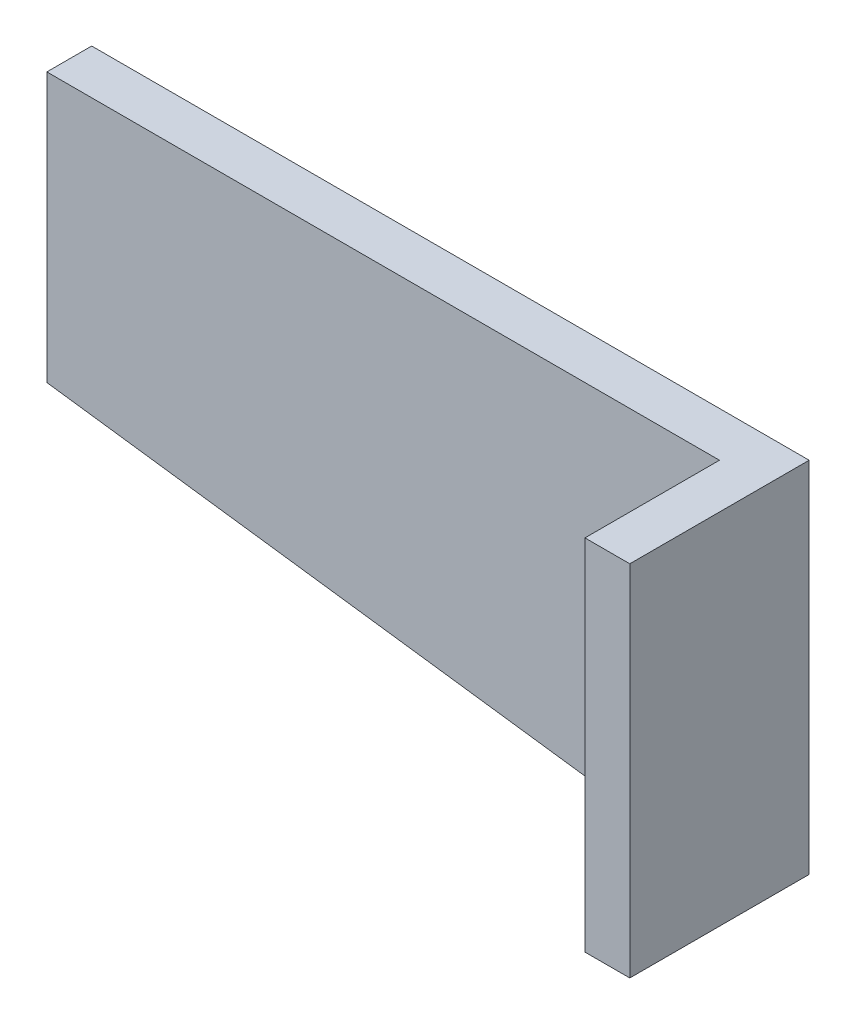
ISO-10303-21;
HEADER;
FILE_DESCRIPTION(('STEP AP214'),'2;1');
FILE_NAME('part.step','',(''),(''),'','','');
FILE_SCHEMA(('AUTOMOTIVE_DESIGN { 1 0 10303 214 1 1 1 1 }'));
ENDSEC;
DATA;
#1=APPLICATION_CONTEXT('core data for automotive mechanical design processes');
#2=APPLICATION_PROTOCOL_DEFINITION('international standard','automotive_design',2000,#1);
#3=PRODUCT_CONTEXT('',#1,'mechanical');
#4=PRODUCT('Part','Part','',(#3));
#5=PRODUCT_RELATED_PRODUCT_CATEGORY('part','',(#4));
#6=PRODUCT_DEFINITION_FORMATION('','',#4);
#7=PRODUCT_DEFINITION_CONTEXT('part definition',#1,'design');
#8=PRODUCT_DEFINITION('design','',#6,#7);
#9=PRODUCT_DEFINITION_SHAPE('','',#8);
#10=(LENGTH_UNIT() NAMED_UNIT(*) SI_UNIT(.MILLI.,.METRE.));
#11=(NAMED_UNIT(*) PLANE_ANGLE_UNIT() SI_UNIT($,.RADIAN.));
#12=(NAMED_UNIT(*) SI_UNIT($,.STERADIAN.) SOLID_ANGLE_UNIT());
#13=UNCERTAINTY_MEASURE_WITH_UNIT(LENGTH_MEASURE(1.E-05),#10,'distance_accuracy_value','');
#14=(GEOMETRIC_REPRESENTATION_CONTEXT(3) GLOBAL_UNCERTAINTY_ASSIGNED_CONTEXT((#13)) GLOBAL_UNIT_ASSIGNED_CONTEXT((#10,
#11,#12)) REPRESENTATION_CONTEXT('',''));
#15=CARTESIAN_POINT('',(0.,0.,0.));
#16=DIRECTION('',(0.,0.,1.));
#17=DIRECTION('',(1.,0.,0.));
#18=AXIS2_PLACEMENT_3D('',#15,#16,#17);
#19=CARTESIAN_POINT('',(-2.49563318777292,-18.7172489082969,3.175));
#20=DIRECTION('',(-0.132163720091018,-0.991227900682635,0.));
#21=DIRECTION('',(0.991227900682635,-0.132163720091018,0.));
#22=AXIS2_PLACEMENT_3D('',#19,#20,#21);
#23=PLANE('',#22);
#24=DIRECTION('',(-0.991227900682635,0.132163720091018,0.));
#25=VECTOR('',#24,1.);
#26=CARTESIAN_POINT('',(-2.49563318777292,-18.7172489082969,0.));
#27=LINE('',#26,#25);
#28=CARTESIAN_POINT('',(47.625,-25.4,0.));
#29=VERTEX_POINT('',#28);
#30=CARTESIAN_POINT('',(0.,-19.05,0.));
#31=VERTEX_POINT('',#30);
#32=EDGE_CURVE('E74',#29,#31,#27,.T.);
#33=ORIENTED_EDGE('',*,*,#32,.F.);
#34=DIRECTION('',(0.,0.,-1.));
#35=VECTOR('',#34,1.);
#36=CARTESIAN_POINT('',(47.625,-25.4,3.175));
#37=LINE('',#36,#35);
#38=CARTESIAN_POINT('',(47.625,-25.4,3.175));
#39=VERTEX_POINT('',#38);
#40=EDGE_CURVE('E11',#39,#29,#37,.T.);
#41=ORIENTED_EDGE('',*,*,#40,.F.);
#42=DIRECTION('',(-0.991227900682635,0.132163720091018,0.));
#43=VECTOR('',#42,1.);
#44=CARTESIAN_POINT('',(-2.49563318777292,-18.7172489082969,3.175));
#45=LINE('',#44,#43);
#46=CARTESIAN_POINT('',(0.,-19.05,3.175));
#47=VERTEX_POINT('',#46);
#48=EDGE_CURVE('E77',#39,#47,#45,.T.);
#49=ORIENTED_EDGE('',*,*,#48,.T.);
#50=DIRECTION('',(0.,0.,-1.));
#51=VECTOR('',#50,1.);
#52=CARTESIAN_POINT('',(0.,-19.05,3.175));
#53=LINE('',#52,#51);
#54=EDGE_CURVE('E52',#47,#31,#53,.T.);
#55=ORIENTED_EDGE('',*,*,#54,.T.);
#56=EDGE_LOOP('',(#33,#41,#49,#55));
#57=FACE_BOUND('',#56,.T.);
#58=ADVANCED_FACE('F36',(#57),#23,.T.);
#59=CARTESIAN_POINT('',(0.,-25.4,3.175));
#60=DIRECTION('',(0.,-1.,0.));
#61=DIRECTION('',(0.,0.,-1.));
#62=AXIS2_PLACEMENT_3D('',#59,#60,#61);
#63=PLANE('',#62);
#64=DIRECTION('',(-1.,0.,0.));
#65=VECTOR('',#64,1.);
#66=CARTESIAN_POINT('',(0.,-25.4,0.));
#67=LINE('',#66,#65);
#68=CARTESIAN_POINT('',(50.8,-25.4,0.));
#69=VERTEX_POINT('',#68);
#70=EDGE_CURVE('E87',#69,#29,#67,.T.);
#71=ORIENTED_EDGE('',*,*,#70,.F.);
#72=DIRECTION('',(0.,0.,-1.));
#73=VECTOR('',#72,1.);
#74=CARTESIAN_POINT('',(50.8,-25.4,3.175));
#75=LINE('',#74,#73);
#76=CARTESIAN_POINT('',(50.8,-25.4,12.7));
#77=VERTEX_POINT('',#76);
#78=EDGE_CURVE('E44',#77,#69,#75,.T.);
#79=ORIENTED_EDGE('',*,*,#78,.F.);
#80=DIRECTION('',(-1.,0.,0.));
#81=VECTOR('',#80,1.);
#82=CARTESIAN_POINT('',(0.,-25.4,12.7));
#83=LINE('',#82,#81);
#84=CARTESIAN_POINT('',(47.625,-25.4,12.7));
#85=VERTEX_POINT('',#84);
#86=EDGE_CURVE('E132',#77,#85,#83,.T.);
#87=ORIENTED_EDGE('',*,*,#86,.T.);
#88=DIRECTION('',(0.,0.,-1.));
#89=VECTOR('',#88,1.);
#90=CARTESIAN_POINT('',(47.625,-25.4,12.7));
#91=LINE('',#90,#89);
#92=EDGE_CURVE('E123',#85,#39,#91,.T.);
#93=ORIENTED_EDGE('',*,*,#92,.T.);
#94=ORIENTED_EDGE('',*,*,#40,.T.);
#95=EDGE_LOOP('',(#71,#79,#87,#93,#94));
#96=FACE_BOUND('',#95,.T.);
#97=ADVANCED_FACE('F114',(#96),#63,.T.);
#98=CARTESIAN_POINT('',(50.8,0.,3.175));
#99=DIRECTION('',(1.,0.,0.));
#100=DIRECTION('',(0.,0.,-1.));
#101=AXIS2_PLACEMENT_3D('',#98,#99,#100);
#102=PLANE('',#101);
#103=DIRECTION('',(0.,-1.,0.));
#104=VECTOR('',#103,1.);
#105=CARTESIAN_POINT('',(50.8,0.,0.));
#106=LINE('',#105,#104);
#107=CARTESIAN_POINT('',(50.8,0.,0.));
#108=VERTEX_POINT('',#107);
#109=EDGE_CURVE('E95',#108,#69,#106,.T.);
#110=ORIENTED_EDGE('',*,*,#109,.F.);
#111=DIRECTION('',(0.,0.,-1.));
#112=VECTOR('',#111,1.);
#113=CARTESIAN_POINT('',(50.8,0.,3.175));
#114=LINE('',#113,#112);
#115=CARTESIAN_POINT('',(50.8,0.,12.7));
#116=VERTEX_POINT('',#115);
#117=EDGE_CURVE('E100',#116,#108,#114,.T.);
#118=ORIENTED_EDGE('',*,*,#117,.F.);
#119=DIRECTION('',(0.,-1.,0.));
#120=VECTOR('',#119,1.);
#121=CARTESIAN_POINT('',(50.8,0.,12.7));
#122=LINE('',#121,#120);
#123=EDGE_CURVE('E110',#116,#77,#122,.T.);
#124=ORIENTED_EDGE('',*,*,#123,.T.);
#125=ORIENTED_EDGE('',*,*,#78,.T.);
#126=EDGE_LOOP('',(#110,#118,#124,#125));
#127=FACE_BOUND('',#126,.T.);
#128=ADVANCED_FACE('F106',(#127),#102,.T.);
#129=CARTESIAN_POINT('',(0.,0.,3.175));
#130=DIRECTION('',(0.,1.,0.));
#131=DIRECTION('',(0.,0.,1.));
#132=AXIS2_PLACEMENT_3D('',#129,#130,#131);
#133=PLANE('',#132);
#134=DIRECTION('',(1.,0.,0.));
#135=VECTOR('',#134,1.);
#136=CARTESIAN_POINT('',(0.,0.,3.175));
#137=LINE('',#136,#135);
#138=CARTESIAN_POINT('',(0.,0.,3.175));
#139=VERTEX_POINT('',#138);
#140=CARTESIAN_POINT('',(47.625,0.,3.175));
#141=VERTEX_POINT('',#140);
#142=EDGE_CURVE('E93',#139,#141,#137,.T.);
#143=ORIENTED_EDGE('',*,*,#142,.T.);
#144=DIRECTION('',(0.,0.,-1.));
#145=VECTOR('',#144,1.);
#146=CARTESIAN_POINT('',(47.625,0.,12.7));
#147=LINE('',#146,#145);
#148=CARTESIAN_POINT('',(47.625,0.,12.7));
#149=VERTEX_POINT('',#148);
#150=EDGE_CURVE('E125',#149,#141,#147,.T.);
#151=ORIENTED_EDGE('',*,*,#150,.F.);
#152=DIRECTION('',(1.,0.,0.));
#153=VECTOR('',#152,1.);
#154=CARTESIAN_POINT('',(0.,0.,12.7));
#155=LINE('',#154,#153);
#156=EDGE_CURVE('E128',#149,#116,#155,.T.);
#157=ORIENTED_EDGE('',*,*,#156,.T.);
#158=ORIENTED_EDGE('',*,*,#117,.T.);
#159=DIRECTION('',(1.,0.,0.));
#160=VECTOR('',#159,1.);
#161=CARTESIAN_POINT('',(0.,0.,0.));
#162=LINE('',#161,#160);
#163=CARTESIAN_POINT('',(0.,0.,0.));
#164=VERTEX_POINT('',#163);
#165=EDGE_CURVE('E91',#164,#108,#162,.T.);
#166=ORIENTED_EDGE('',*,*,#165,.F.);
#167=DIRECTION('',(0.,0.,-1.));
#168=VECTOR('',#167,1.);
#169=CARTESIAN_POINT('',(0.,0.,3.175));
#170=LINE('',#169,#168);
#171=EDGE_CURVE('E68',#139,#164,#170,.T.);
#172=ORIENTED_EDGE('',*,*,#171,.F.);
#173=EDGE_LOOP('',(#143,#151,#157,#158,#166,#172));
#174=FACE_BOUND('',#173,.T.);
#175=ADVANCED_FACE('F151',(#174),#133,.T.);
#176=CARTESIAN_POINT('',(0.,0.,3.175));
#177=DIRECTION('',(-1.,0.,0.));
#178=DIRECTION('',(0.,0.,1.));
#179=AXIS2_PLACEMENT_3D('',#176,#177,#178);
#180=PLANE('',#179);
#181=DIRECTION('',(0.,1.,0.));
#182=VECTOR('',#181,1.);
#183=CARTESIAN_POINT('',(0.,0.,0.));
#184=LINE('',#183,#182);
#185=EDGE_CURVE('E84',#31,#164,#184,.T.);
#186=ORIENTED_EDGE('',*,*,#185,.F.);
#187=ORIENTED_EDGE('',*,*,#54,.F.);
#188=DIRECTION('',(0.,1.,0.));
#189=VECTOR('',#188,1.);
#190=CARTESIAN_POINT('',(0.,0.,3.175));
#191=LINE('',#190,#189);
#192=EDGE_CURVE('E79',#47,#139,#191,.T.);
#193=ORIENTED_EDGE('',*,*,#192,.T.);
#194=ORIENTED_EDGE('',*,*,#171,.T.);
#195=EDGE_LOOP('',(#186,#187,#193,#194));
#196=FACE_BOUND('',#195,.T.);
#197=ADVANCED_FACE('F90',(#196),#180,.T.);
#198=CARTESIAN_POINT('',(0.,0.,3.175));
#199=DIRECTION('',(0.,0.,1.));
#200=DIRECTION('',(1.,0.,0.));
#201=AXIS2_PLACEMENT_3D('',#198,#199,#200);
#202=PLANE('',#201);
#203=DIRECTION('',(0.,-1.,0.));
#204=VECTOR('',#203,1.);
#205=CARTESIAN_POINT('',(47.625,0.,3.175));
#206=LINE('',#205,#204);
#207=EDGE_CURVE('E88',#141,#39,#206,.T.);
#208=ORIENTED_EDGE('',*,*,#207,.F.);
#209=ORIENTED_EDGE('',*,*,#142,.F.);
#210=ORIENTED_EDGE('',*,*,#192,.F.);
#211=ORIENTED_EDGE('',*,*,#48,.F.);
#212=EDGE_LOOP('',(#208,#209,#210,#211));
#213=FACE_BOUND('',#212,.T.);
#214=ADVANCED_FACE('F158',(#213),#202,.T.);
#215=CARTESIAN_POINT('',(0.,0.,0.));
#216=DIRECTION('',(0.,0.,1.));
#217=DIRECTION('',(1.,0.,0.));
#218=AXIS2_PLACEMENT_3D('',#215,#216,#217);
#219=PLANE('',#218);
#220=ORIENTED_EDGE('',*,*,#165,.T.);
#221=ORIENTED_EDGE('',*,*,#109,.T.);
#222=ORIENTED_EDGE('',*,*,#70,.T.);
#223=ORIENTED_EDGE('',*,*,#32,.T.);
#224=ORIENTED_EDGE('',*,*,#185,.T.);
#225=EDGE_LOOP('',(#220,#221,#222,#223,#224));
#226=FACE_BOUND('',#225,.T.);
#227=ADVANCED_FACE('F83',(#226),#219,.F.);
#228=CARTESIAN_POINT('',(47.625,0.,12.7));
#229=DIRECTION('',(-1.,0.,0.));
#230=DIRECTION('',(0.,0.,1.));
#231=AXIS2_PLACEMENT_3D('',#228,#229,#230);
#232=PLANE('',#231);
#233=ORIENTED_EDGE('',*,*,#150,.T.);
#234=ORIENTED_EDGE('',*,*,#207,.T.);
#235=ORIENTED_EDGE('',*,*,#92,.F.);
#236=DIRECTION('',(0.,1.,0.));
#237=VECTOR('',#236,1.);
#238=CARTESIAN_POINT('',(47.625,0.,12.7));
#239=LINE('',#238,#237);
#240=EDGE_CURVE('E134',#85,#149,#239,.T.);
#241=ORIENTED_EDGE('',*,*,#240,.T.);
#242=EDGE_LOOP('',(#233,#234,#235,#241));
#243=FACE_BOUND('',#242,.T.);
#244=ADVANCED_FACE('F141',(#243),#232,.T.);
#245=CARTESIAN_POINT('',(0.,0.,12.7));
#246=DIRECTION('',(0.,0.,1.));
#247=DIRECTION('',(1.,0.,0.));
#248=AXIS2_PLACEMENT_3D('',#245,#246,#247);
#249=PLANE('',#248);
#250=ORIENTED_EDGE('',*,*,#240,.F.);
#251=ORIENTED_EDGE('',*,*,#86,.F.);
#252=ORIENTED_EDGE('',*,*,#123,.F.);
#253=ORIENTED_EDGE('',*,*,#156,.F.);
#254=EDGE_LOOP('',(#250,#251,#252,#253));
#255=FACE_BOUND('',#254,.T.);
#256=ADVANCED_FACE('F149',(#255),#249,.T.);
#257=CLOSED_SHELL('',(#58,#97,#128,#175,#197,#214,#227,#244,#256));
#258=MANIFOLD_SOLID_BREP('B2',#257);
#259=ADVANCED_BREP_SHAPE_REPRESENTATION('',(#18,#258),#14);
#260=SHAPE_DEFINITION_REPRESENTATION(#9,#259);
ENDSEC;
END-ISO-10303-21;
